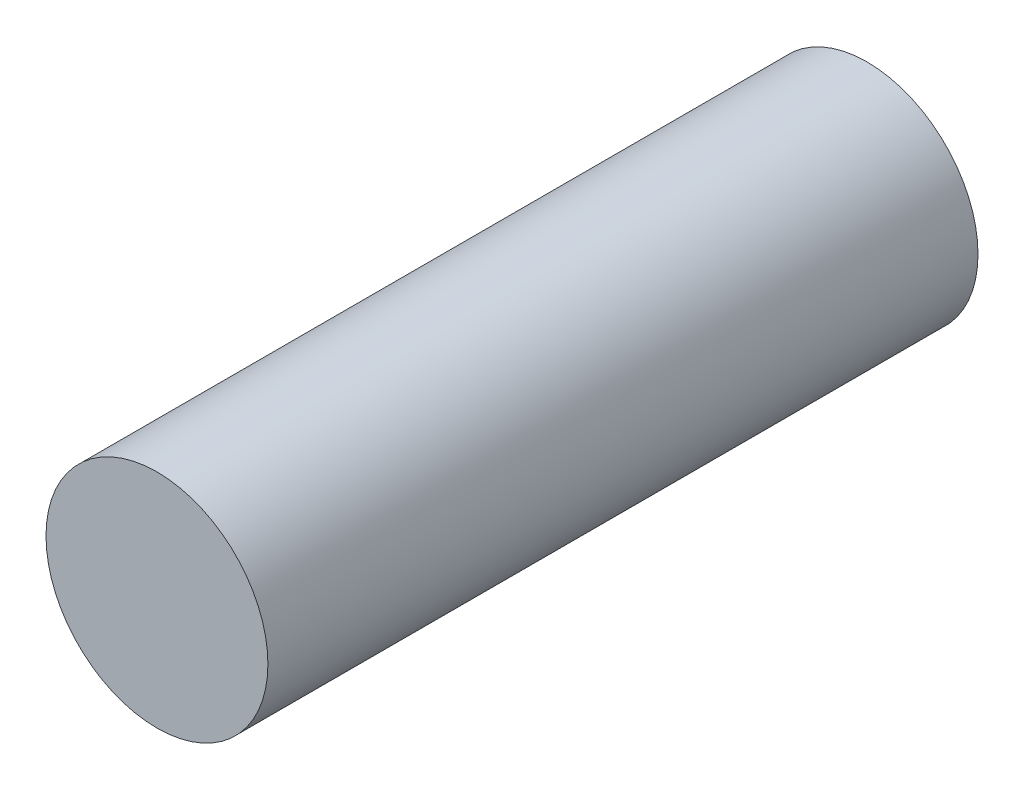
ISO-10303-21;
HEADER;
FILE_DESCRIPTION(('STEP AP214'),'2;1');
FILE_NAME('part.step','',(''),(''),'','','');
FILE_SCHEMA(('AUTOMOTIVE_DESIGN { 1 0 10303 214 1 1 1 1 }'));
ENDSEC;
DATA;
#1=APPLICATION_CONTEXT('core data for automotive mechanical design processes');
#2=APPLICATION_PROTOCOL_DEFINITION('international standard','automotive_design',2000,#1);
#3=PRODUCT_CONTEXT('',#1,'mechanical');
#4=PRODUCT('Part','Part','',(#3));
#5=PRODUCT_RELATED_PRODUCT_CATEGORY('part','',(#4));
#6=PRODUCT_DEFINITION_FORMATION('','',#4);
#7=PRODUCT_DEFINITION_CONTEXT('part definition',#1,'design');
#8=PRODUCT_DEFINITION('design','',#6,#7);
#9=PRODUCT_DEFINITION_SHAPE('','',#8);
#10=(LENGTH_UNIT() NAMED_UNIT(*) SI_UNIT(.MILLI.,.METRE.));
#11=(NAMED_UNIT(*) PLANE_ANGLE_UNIT() SI_UNIT($,.RADIAN.));
#12=(NAMED_UNIT(*) SI_UNIT($,.STERADIAN.) SOLID_ANGLE_UNIT());
#13=UNCERTAINTY_MEASURE_WITH_UNIT(LENGTH_MEASURE(1.E-05),#10,'distance_accuracy_value','');
#14=(GEOMETRIC_REPRESENTATION_CONTEXT(3) GLOBAL_UNCERTAINTY_ASSIGNED_CONTEXT((#13)) GLOBAL_UNIT_ASSIGNED_CONTEXT((#10,
#11,#12)) REPRESENTATION_CONTEXT('',''));
#15=CARTESIAN_POINT('',(0.,0.,0.));
#16=DIRECTION('',(0.,0.,1.));
#17=DIRECTION('',(1.,0.,0.));
#18=AXIS2_PLACEMENT_3D('',#15,#16,#17);
#19=CARTESIAN_POINT('',(0.,0.,32.));
#20=DIRECTION('',(0.,0.,-1.));
#21=DIRECTION('',(-1.,0.,0.));
#22=AXIS2_PLACEMENT_3D('',#19,#20,#21);
#23=CYLINDRICAL_SURFACE('',#22,5.);
#24=CARTESIAN_POINT('',(0.,0.,32.));
#25=DIRECTION('',(0.,0.,1.));
#26=DIRECTION('',(1.,0.,0.));
#27=AXIS2_PLACEMENT_3D('',#24,#25,#26);
#28=CIRCLE('',#27,5.);
#29=CARTESIAN_POINT('',(5.,0.,32.));
#30=VERTEX_POINT('',#29);
#31=EDGE_CURVE('E10',#30,#30,#28,.T.);
#32=ORIENTED_EDGE('',*,*,#31,.F.);
#33=EDGE_LOOP('',(#32));
#34=FACE_BOUND('',#33,.T.);
#35=CARTESIAN_POINT('',(0.,0.,0.));
#36=DIRECTION('',(0.,0.,1.));
#37=DIRECTION('',(1.,0.,0.));
#38=AXIS2_PLACEMENT_3D('',#35,#36,#37);
#39=CIRCLE('',#38,5.);
#40=CARTESIAN_POINT('',(5.,0.,0.));
#41=VERTEX_POINT('',#40);
#42=EDGE_CURVE('E36',#41,#41,#39,.T.);
#43=ORIENTED_EDGE('',*,*,#42,.T.);
#44=EDGE_LOOP('',(#43));
#45=FACE_BOUND('',#44,.T.);
#46=ADVANCED_FACE('F33',(#34,#45),#23,.T.);
#47=CARTESIAN_POINT('',(0.,0.,32.));
#48=DIRECTION('',(0.,0.,1.));
#49=DIRECTION('',(1.,0.,0.));
#50=AXIS2_PLACEMENT_3D('',#47,#48,#49);
#51=PLANE('',#50);
#52=ORIENTED_EDGE('',*,*,#31,.T.);
#53=EDGE_LOOP('',(#52));
#54=FACE_BOUND('',#53,.T.);
#55=ADVANCED_FACE('F48',(#54),#51,.T.);
#56=CARTESIAN_POINT('',(0.,0.,0.));
#57=DIRECTION('',(0.,0.,1.));
#58=DIRECTION('',(1.,0.,0.));
#59=AXIS2_PLACEMENT_3D('',#56,#57,#58);
#60=PLANE('',#59);
#61=ORIENTED_EDGE('',*,*,#42,.F.);
#62=EDGE_LOOP('',(#61));
#63=FACE_BOUND('',#62,.T.);
#64=ADVANCED_FACE('F46',(#63),#60,.F.);
#65=CLOSED_SHELL('',(#46,#55,#64));
#66=MANIFOLD_SOLID_BREP('B2',#65);
#67=ADVANCED_BREP_SHAPE_REPRESENTATION('',(#18,#66),#14);
#68=SHAPE_DEFINITION_REPRESENTATION(#9,#67);
ENDSEC;
END-ISO-10303-21;
